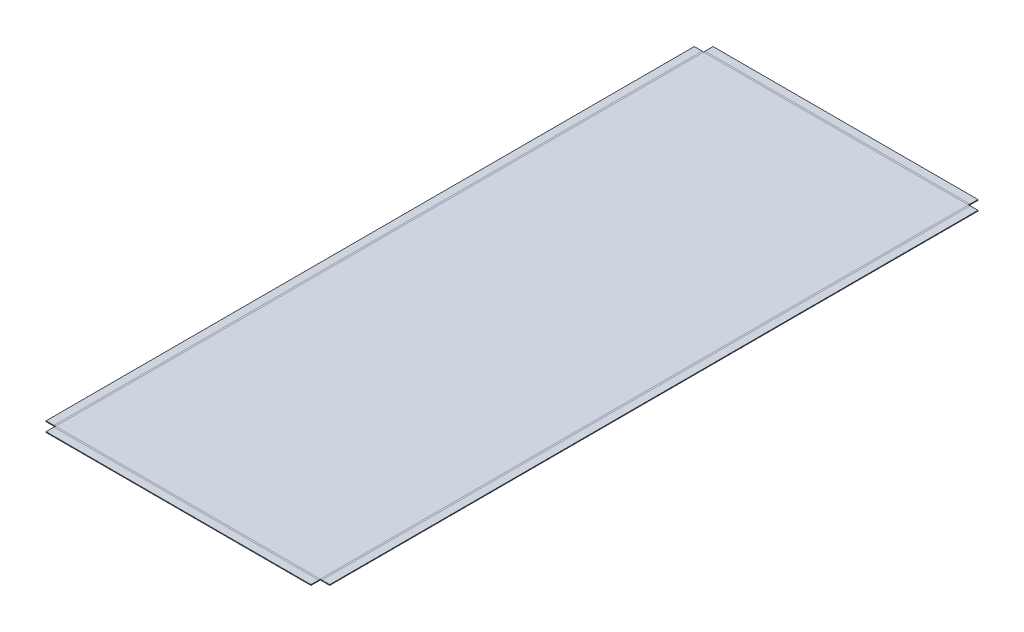
ISO-10303-21;
HEADER;
FILE_DESCRIPTION(('STEP AP214'),'2;1');
FILE_NAME('part.step','',(''),(''),'','','');
FILE_SCHEMA(('AUTOMOTIVE_DESIGN { 1 0 10303 214 1 1 1 1 }'));
ENDSEC;
DATA;
#1=APPLICATION_CONTEXT('core data for automotive mechanical design processes');
#2=APPLICATION_PROTOCOL_DEFINITION('international standard','automotive_design',2000,#1);
#3=PRODUCT_CONTEXT('',#1,'mechanical');
#4=PRODUCT('Part','Part','',(#3));
#5=PRODUCT_RELATED_PRODUCT_CATEGORY('part','',(#4));
#6=PRODUCT_DEFINITION_FORMATION('','',#4);
#7=PRODUCT_DEFINITION_CONTEXT('part definition',#1,'design');
#8=PRODUCT_DEFINITION('design','',#6,#7);
#9=PRODUCT_DEFINITION_SHAPE('','',#8);
#10=(LENGTH_UNIT() NAMED_UNIT(*) SI_UNIT(.MILLI.,.METRE.));
#11=(NAMED_UNIT(*) PLANE_ANGLE_UNIT() SI_UNIT($,.RADIAN.));
#12=(NAMED_UNIT(*) SI_UNIT($,.STERADIAN.) SOLID_ANGLE_UNIT());
#13=UNCERTAINTY_MEASURE_WITH_UNIT(LENGTH_MEASURE(1.E-05),#10,'distance_accuracy_value','');
#14=(GEOMETRIC_REPRESENTATION_CONTEXT(3) GLOBAL_UNCERTAINTY_ASSIGNED_CONTEXT((#13)) GLOBAL_UNIT_ASSIGNED_CONTEXT((#10,
#11,#12)) REPRESENTATION_CONTEXT('',''));
#15=CARTESIAN_POINT('',(0.,0.,0.));
#16=DIRECTION('',(0.,0.,1.));
#17=DIRECTION('',(1.,0.,0.));
#18=AXIS2_PLACEMENT_3D('',#15,#16,#17);
#19=CARTESIAN_POINT('',(0.,1.9,0.));
#20=DIRECTION('',(0.,1.,0.));
#21=DIRECTION('',(0.,0.,1.));
#22=AXIS2_PLACEMENT_3D('',#19,#20,#21);
#23=PLANE('',#22);
#24=DIRECTION('',(1.,0.,0.));
#25=VECTOR('',#24,1.);
#26=CARTESIAN_POINT('',(-356.685786437627,1.9,-872.2));
#27=LINE('',#26,#25);
#28=CARTESIAN_POINT('',(-356.2,1.9,-872.2));
#29=VERTEX_POINT('',#28);
#30=CARTESIAN_POINT('',(356.2,1.90000000000003,-872.2));
#31=VERTEX_POINT('',#30);
#32=EDGE_CURVE('E711',#29,#31,#27,.T.);
#33=ORIENTED_EDGE('',*,*,#32,.F.);
#34=DIRECTION('',(0.,0.,-1.));
#35=VECTOR('',#34,1.);
#36=CARTESIAN_POINT('',(-356.2,1.90000000000003,872.685786437627));
#37=LINE('',#36,#35);
#38=CARTESIAN_POINT('',(-356.2,1.90000000000001,872.2));
#39=VERTEX_POINT('',#38);
#40=EDGE_CURVE('E712',#39,#29,#37,.T.);
#41=ORIENTED_EDGE('',*,*,#40,.F.);
#42=DIRECTION('',(-1.,0.,0.));
#43=VECTOR('',#42,1.);
#44=CARTESIAN_POINT('',(356.685786437627,1.90000000000001,872.2));
#45=LINE('',#44,#43);
#46=CARTESIAN_POINT('',(356.2,1.90000000000001,872.2));
#47=VERTEX_POINT('',#46);
#48=EDGE_CURVE('E862',#47,#39,#45,.T.);
#49=ORIENTED_EDGE('',*,*,#48,.F.);
#50=DIRECTION('',(0.,0.,1.));
#51=VECTOR('',#50,1.);
#52=CARTESIAN_POINT('',(356.2,1.90000000000003,-872.685786437627));
#53=LINE('',#52,#51);
#54=EDGE_CURVE('E794',#31,#47,#53,.T.);
#55=ORIENTED_EDGE('',*,*,#54,.F.);
#56=EDGE_LOOP('',(#33,#41,#49,#55));
#57=FACE_BOUND('',#56,.T.);
#58=ADVANCED_FACE('F171',(#57),#23,.T.);
#59=CARTESIAN_POINT('',(0.,0.,0.));
#60=DIRECTION('',(0.,1.,0.));
#61=DIRECTION('',(0.,0.,1.));
#62=AXIS2_PLACEMENT_3D('',#59,#60,#61);
#63=PLANE('',#62);
#64=DIRECTION('',(0.,0.,-1.));
#65=VECTOR('',#64,1.);
#66=CARTESIAN_POINT('',(-356.2,0.,872.685786437627));
#67=LINE('',#66,#65);
#68=CARTESIAN_POINT('',(-356.2,0.,872.2));
#69=VERTEX_POINT('',#68);
#70=CARTESIAN_POINT('',(-356.2,0.,-872.199999999999));
#71=VERTEX_POINT('',#70);
#72=EDGE_CURVE('E703',#69,#71,#67,.T.);
#73=ORIENTED_EDGE('',*,*,#72,.T.);
#74=DIRECTION('',(1.,0.,0.));
#75=VECTOR('',#74,1.);
#76=CARTESIAN_POINT('',(-356.685786437627,0.,-872.2));
#77=LINE('',#76,#75);
#78=CARTESIAN_POINT('',(356.2,0.,-872.2));
#79=VERTEX_POINT('',#78);
#80=EDGE_CURVE('E776',#71,#79,#77,.T.);
#81=ORIENTED_EDGE('',*,*,#80,.T.);
#82=DIRECTION('',(0.,0.,1.));
#83=VECTOR('',#82,1.);
#84=CARTESIAN_POINT('',(356.2,0.,-872.685786437627));
#85=LINE('',#84,#83);
#86=CARTESIAN_POINT('',(356.2,0.,872.199999999999));
#87=VERTEX_POINT('',#86);
#88=EDGE_CURVE('E863',#79,#87,#85,.T.);
#89=ORIENTED_EDGE('',*,*,#88,.T.);
#90=DIRECTION('',(-1.,0.,0.));
#91=VECTOR('',#90,1.);
#92=CARTESIAN_POINT('',(356.685786437627,0.,872.2));
#93=LINE('',#92,#91);
#94=EDGE_CURVE('E182',#87,#69,#93,.T.);
#95=ORIENTED_EDGE('',*,*,#94,.T.);
#96=EDGE_LOOP('',(#73,#81,#89,#95));
#97=FACE_BOUND('',#96,.T.);
#98=ADVANCED_FACE('F173',(#97),#63,.F.);
#99=CARTESIAN_POINT('',(-356.2,1.89999999999993,-872.199999999999));
#100=DIRECTION('',(0.107879437790235,0.,-0.994163983909125));
#101=DIRECTION('',(-0.994163983909125,0.,-0.107879437790235));
#102=AXIS2_PLACEMENT_3D('',#99,#100,#101);
#103=PLANE('',#102);
#104=DIRECTION('',(0.,1.,0.));
#105=VECTOR('',#104,1.);
#106=CARTESIAN_POINT('',(-356.2,1.89999999999993,-872.199999999999));
#107=LINE('',#106,#105);
#108=EDGE_CURVE('E781',#29,#71,#107,.F.);
#109=ORIENTED_EDGE('',*,*,#108,.T.);
#110=DIRECTION('',(-0.994163983909125,0.,-0.107879437790235));
#111=VECTOR('',#110,1.);
#112=CARTESIAN_POINT('',(-356.2,0.,-872.199999999999));
#113=LINE('',#112,#111);
#114=CARTESIAN_POINT('',(-360.676769531365,0.,-872.685786437625));
#115=VERTEX_POINT('',#114);
#116=EDGE_CURVE('E723',#71,#115,#113,.T.);
#117=ORIENTED_EDGE('',*,*,#116,.T.);
#118=CARTESIAN_POINT('',(-360.676769531365,0.,-872.685786437626));
#119=DIRECTION('',(0.,1.,0.));
#120=VECTOR('',#119,1.);
#121=LINE('',#118,#120);
#122=CARTESIAN_POINT('',(-360.676769531365,1.90000000000001,-872.685786437626));
#123=VERTEX_POINT('',#122);
#124=EDGE_CURVE('E669',#115,#123,#121,.T.);
#125=ORIENTED_EDGE('',*,*,#124,.T.);
#126=DIRECTION('',(-0.994163983909125,0.,-0.107879437790235));
#127=VECTOR('',#126,1.);
#128=CARTESIAN_POINT('',(-356.2,1.89999999999993,-872.199999999999));
#129=LINE('',#128,#127);
#130=EDGE_CURVE('E788',#29,#123,#129,.T.);
#131=ORIENTED_EDGE('',*,*,#130,.F.);
#132=EDGE_LOOP('',(#109,#117,#125,#131));
#133=FACE_BOUND('',#132,.T.);
#134=ADVANCED_FACE('F683',(#133),#103,.T.);
#135=CARTESIAN_POINT('',(-360.676769531365,1.89999999999993,872.685786437627));
#136=DIRECTION('',(0.107879437790241,0.,0.994163983909124));
#137=DIRECTION('',(0.994163983909124,0.,-0.107879437790241));
#138=AXIS2_PLACEMENT_3D('',#135,#136,#137);
#139=PLANE('',#138);
#140=DIRECTION('',(0.994163983909124,0.,-0.107879437790241));
#141=VECTOR('',#140,1.);
#142=CARTESIAN_POINT('',(-360.676769531365,0.,872.685786437627));
#143=LINE('',#142,#141);
#144=CARTESIAN_POINT('',(-360.676769531365,4.44089209850063E-13,872.685786437627));
#145=VERTEX_POINT('',#144);
#146=EDGE_CURVE('E785',#145,#69,#143,.T.);
#147=ORIENTED_EDGE('',*,*,#146,.T.);
#148=DIRECTION('',(0.,1.,0.));
#149=VECTOR('',#148,1.);
#150=CARTESIAN_POINT('',(-356.2,1.90000000000001,872.2));
#151=LINE('',#150,#149);
#152=EDGE_CURVE('E923',#39,#69,#151,.F.);
#153=ORIENTED_EDGE('',*,*,#152,.F.);
#154=DIRECTION('',(0.994163983909124,0.,-0.107879437790241));
#155=VECTOR('',#154,1.);
#156=CARTESIAN_POINT('',(-360.676769531365,1.89999999999993,872.685786437627));
#157=LINE('',#156,#155);
#158=CARTESIAN_POINT('',(-360.676769531365,1.9000000000002,872.685786437627));
#159=VERTEX_POINT('',#158);
#160=EDGE_CURVE('E717',#159,#39,#157,.T.);
#161=ORIENTED_EDGE('',*,*,#160,.F.);
#162=CARTESIAN_POINT('',(-360.676769531365,4.44089209850063E-13,872.685786437627));
#163=DIRECTION('',(0.,1.,0.));
#164=VECTOR('',#163,1.);
#165=LINE('',#162,#164);
#166=EDGE_CURVE('E658',#145,#159,#165,.T.);
#167=ORIENTED_EDGE('',*,*,#166,.F.);
#168=EDGE_LOOP('',(#147,#153,#161,#167));
#169=FACE_BOUND('',#168,.T.);
#170=ADVANCED_FACE('F693',(#169),#139,.T.);
#171=CARTESIAN_POINT('',(-358.438384765683,1.89999999999993,3.33066907387547E-13));
#172=DIRECTION('',(0.,1.,0.));
#173=DIRECTION('',(0.,0.,1.));
#174=AXIS2_PLACEMENT_3D('',#171,#172,#173);
#175=PLANE('',#174);
#176=DIRECTION('',(0.,0.,1.));
#177=VECTOR('',#176,1.);
#178=CARTESIAN_POINT('',(-360.676769531366,1.90000000000001,-876.));
#179=LINE('',#178,#177);
#180=EDGE_CURVE('E726',#123,#159,#179,.T.);
#181=ORIENTED_EDGE('',*,*,#180,.T.);
#182=ORIENTED_EDGE('',*,*,#160,.T.);
#183=ORIENTED_EDGE('',*,*,#40,.T.);
#184=ORIENTED_EDGE('',*,*,#130,.T.);
#185=EDGE_LOOP('',(#181,#182,#183,#184));
#186=FACE_BOUND('',#185,.T.);
#187=ADVANCED_FACE('F698',(#186),#175,.T.);
#188=CARTESIAN_POINT('',(-358.438384765683,0.,3.33066907387547E-13));
#189=DIRECTION('',(0.,1.,0.));
#190=DIRECTION('',(0.,0.,1.));
#191=AXIS2_PLACEMENT_3D('',#188,#189,#190);
#192=PLANE('',#191);
#193=DIRECTION('',(0.,0.,-1.));
#194=VECTOR('',#193,1.);
#195=CARTESIAN_POINT('',(-360.676769531366,0.,-876.));
#196=LINE('',#195,#194);
#197=EDGE_CURVE('E729',#145,#115,#196,.T.);
#198=ORIENTED_EDGE('',*,*,#197,.T.);
#199=ORIENTED_EDGE('',*,*,#116,.F.);
#200=ORIENTED_EDGE('',*,*,#72,.F.);
#201=ORIENTED_EDGE('',*,*,#146,.F.);
#202=EDGE_LOOP('',(#198,#199,#200,#201));
#203=FACE_BOUND('',#202,.T.);
#204=ADVANCED_FACE('F694',(#203),#192,.F.);
#205=CARTESIAN_POINT('',(-381.876769531366,-1.66533453693773E-13,-876.));
#206=DIRECTION('',(1.,0.,0.));
#207=DIRECTION('',(0.,1.,0.));
#208=AXIS2_PLACEMENT_3D('',#205,#206,#207);
#209=PLANE('',#208);
#210=DIRECTION('',(0.,0.,-1.));
#211=VECTOR('',#210,1.);
#212=CARTESIAN_POINT('',(-381.876769531365,0.,0.));
#213=LINE('',#212,#211);
#214=CARTESIAN_POINT('',(-381.876769531365,2.77555756156289E-13,872.685786437627));
#215=VERTEX_POINT('',#214);
#216=CARTESIAN_POINT('',(-381.876769531366,-1.66533453693773E-13,-872.685786437627));
#217=VERTEX_POINT('',#216);
#218=EDGE_CURVE('E651',#215,#217,#213,.T.);
#219=ORIENTED_EDGE('',*,*,#218,.F.);
#220=DIRECTION('',(0.,1.,0.));
#221=VECTOR('',#220,1.);
#222=CARTESIAN_POINT('',(-381.876769531365,0.,872.685786437627));
#223=LINE('',#222,#221);
#224=CARTESIAN_POINT('',(-381.876769531365,1.90000000000029,872.685786437627));
#225=VERTEX_POINT('',#224);
#226=EDGE_CURVE('E667',#215,#225,#223,.T.);
#227=ORIENTED_EDGE('',*,*,#226,.T.);
#228=DIRECTION('',(0.,0.,1.));
#229=VECTOR('',#228,1.);
#230=CARTESIAN_POINT('',(-381.876769531366,1.89999999999985,-876.));
#231=LINE('',#230,#229);
#232=CARTESIAN_POINT('',(-381.876769531366,1.89999999999985,-872.685786437627));
#233=VERTEX_POINT('',#232);
#234=EDGE_CURVE('E664',#225,#233,#231,.F.);
#235=ORIENTED_EDGE('',*,*,#234,.T.);
#236=DIRECTION('',(0.,-1.,0.));
#237=VECTOR('',#236,1.);
#238=CARTESIAN_POINT('',(-381.876769531366,1.89999999999985,-872.685786437627));
#239=LINE('',#238,#237);
#240=EDGE_CURVE('E660',#217,#233,#239,.F.);
#241=ORIENTED_EDGE('',*,*,#240,.F.);
#242=EDGE_LOOP('',(#219,#227,#235,#241));
#243=FACE_BOUND('',#242,.T.);
#244=ADVANCED_FACE('F620',(#243),#209,.F.);
#245=CARTESIAN_POINT('',(-356.876769531365,1.90000000000023,0.));
#246=DIRECTION('',(0.,1.,0.));
#247=DIRECTION('',(-1.,0.,0.));
#248=AXIS2_PLACEMENT_3D('',#245,#246,#247);
#249=PLANE('',#248);
#250=DIRECTION('',(1.,0.,0.));
#251=VECTOR('',#250,1.);
#252=CARTESIAN_POINT('',(-358.776769531365,1.90000000000046,872.685786437627));
#253=LINE('',#252,#251);
#254=EDGE_CURVE('E720',#159,#225,#253,.F.);
#255=ORIENTED_EDGE('',*,*,#254,.F.);
#256=ORIENTED_EDGE('',*,*,#180,.F.);
#257=DIRECTION('',(-1.,0.,0.));
#258=VECTOR('',#257,1.);
#259=CARTESIAN_POINT('',(-356.876769531365,1.90000000000001,-872.685786437627));
#260=LINE('',#259,#258);
#261=EDGE_CURVE('E666',#123,#233,#260,.T.);
#262=ORIENTED_EDGE('',*,*,#261,.T.);
#263=ORIENTED_EDGE('',*,*,#234,.F.);
#264=EDGE_LOOP('',(#255,#256,#262,#263));
#265=FACE_BOUND('',#264,.T.);
#266=ADVANCED_FACE('F755',(#265),#249,.T.);
#267=CARTESIAN_POINT('',(-358.776769531366,1.90000000000001,-872.685786437627));
#268=DIRECTION('',(0.,0.,-1.));
#269=DIRECTION('',(-1.,0.,0.));
#270=AXIS2_PLACEMENT_3D('',#267,#268,#269);
#271=PLANE('',#270);
#272=DIRECTION('',(1.,0.,0.));
#273=VECTOR('',#272,1.);
#274=CARTESIAN_POINT('',(-358.776769531366,0.,-872.685786437627));
#275=LINE('',#274,#273);
#276=EDGE_CURVE('E663',#115,#217,#275,.F.);
#277=ORIENTED_EDGE('',*,*,#276,.T.);
#278=ORIENTED_EDGE('',*,*,#240,.T.);
#279=ORIENTED_EDGE('',*,*,#261,.F.);
#280=ORIENTED_EDGE('',*,*,#124,.F.);
#281=EDGE_LOOP('',(#277,#278,#279,#280));
#282=FACE_BOUND('',#281,.T.);
#283=ADVANCED_FACE('F745',(#282),#271,.T.);
#284=CARTESIAN_POINT('',(-356.876769531365,2.22044604925031E-13,0.));
#285=DIRECTION('',(0.,1.,0.));
#286=DIRECTION('',(-1.,0.,0.));
#287=AXIS2_PLACEMENT_3D('',#284,#285,#286);
#288=PLANE('',#287);
#289=ORIENTED_EDGE('',*,*,#197,.F.);
#290=DIRECTION('',(-1.,0.,0.));
#291=VECTOR('',#290,1.);
#292=CARTESIAN_POINT('',(-356.876769531364,4.44089209850063E-13,872.685786437627));
#293=LINE('',#292,#291);
#294=EDGE_CURVE('E659',#145,#215,#293,.T.);
#295=ORIENTED_EDGE('',*,*,#294,.T.);
#296=ORIENTED_EDGE('',*,*,#218,.T.);
#297=ORIENTED_EDGE('',*,*,#276,.F.);
#298=EDGE_LOOP('',(#289,#295,#296,#297));
#299=FACE_BOUND('',#298,.T.);
#300=ADVANCED_FACE('F754',(#299),#288,.F.);
#301=CARTESIAN_POINT('',(-358.776769531365,1.90000000000046,872.685786437627));
#302=DIRECTION('',(0.,0.,-1.));
#303=DIRECTION('',(-1.,0.,0.));
#304=AXIS2_PLACEMENT_3D('',#301,#302,#303);
#305=PLANE('',#304);
#306=ORIENTED_EDGE('',*,*,#226,.F.);
#307=ORIENTED_EDGE('',*,*,#294,.F.);
#308=ORIENTED_EDGE('',*,*,#166,.T.);
#309=ORIENTED_EDGE('',*,*,#254,.T.);
#310=EDGE_LOOP('',(#306,#307,#308,#309));
#311=FACE_BOUND('',#310,.T.);
#312=ADVANCED_FACE('F758',(#311),#305,.F.);
#313=CARTESIAN_POINT('',(356.2,1.9,-872.2));
#314=DIRECTION('',(0.994163983909123,0.,0.107879437790257));
#315=DIRECTION('',(0.107879437790257,0.,-0.994163983909123));
#316=AXIS2_PLACEMENT_3D('',#313,#314,#315);
#317=PLANE('',#316);
#318=DIRECTION('',(0.,1.,0.));
#319=VECTOR('',#318,1.);
#320=CARTESIAN_POINT('',(356.2,1.9,-872.2));
#321=LINE('',#320,#319);
#322=EDGE_CURVE('E852',#31,#79,#321,.F.);
#323=ORIENTED_EDGE('',*,*,#322,.T.);
#324=DIRECTION('',(0.107879437790257,0.,-0.994163983909123));
#325=VECTOR('',#324,1.);
#326=CARTESIAN_POINT('',(356.2,0.,-872.2));
#327=LINE('',#326,#325);
#328=CARTESIAN_POINT('',(356.685786437626,0.,-876.676769531365));
#329=VERTEX_POINT('',#328);
#330=EDGE_CURVE('E800',#79,#329,#327,.T.);
#331=ORIENTED_EDGE('',*,*,#330,.T.);
#332=CARTESIAN_POINT('',(356.685786437627,0.,-876.676769531365));
#333=DIRECTION('',(0.,1.,0.));
#334=VECTOR('',#333,1.);
#335=LINE('',#332,#334);
#336=CARTESIAN_POINT('',(356.685786437626,1.90000000000001,-876.676769531365));
#337=VERTEX_POINT('',#336);
#338=EDGE_CURVE('E563',#329,#337,#335,.T.);
#339=ORIENTED_EDGE('',*,*,#338,.T.);
#340=DIRECTION('',(0.107879437790257,0.,-0.994163983909123));
#341=VECTOR('',#340,1.);
#342=CARTESIAN_POINT('',(356.2,1.9,-872.2));
#343=LINE('',#342,#341);
#344=EDGE_CURVE('E850',#31,#337,#343,.T.);
#345=ORIENTED_EDGE('',*,*,#344,.F.);
#346=EDGE_LOOP('',(#323,#331,#339,#345));
#347=FACE_BOUND('',#346,.T.);
#348=ADVANCED_FACE('F590',(#347),#317,.T.);
#349=CARTESIAN_POINT('',(-356.685786437627,1.9,-876.676769531365));
#350=DIRECTION('',(-0.994163983909123,0.,0.107879437790257));
#351=DIRECTION('',(0.107879437790257,0.,0.994163983909123));
#352=AXIS2_PLACEMENT_3D('',#349,#350,#351);
#353=PLANE('',#352);
#354=CARTESIAN_POINT('',(-356.685786437627,0.,-876.676769531365));
#355=DIRECTION('',(0.107879437790257,0.,0.994163983909123));
#356=VECTOR('',#355,1.);
#357=LINE('',#354,#356);
#358=CARTESIAN_POINT('',(-356.685786437627,0.,-876.676769531365));
#359=VERTEX_POINT('',#358);
#360=EDGE_CURVE('E853',#359,#71,#357,.T.);
#361=ORIENTED_EDGE('',*,*,#360,.T.);
#362=ORIENTED_EDGE('',*,*,#108,.F.);
#363=CARTESIAN_POINT('',(-356.685786437627,1.9,-876.676769531365));
#364=DIRECTION('',(0.107879437790257,0.,0.994163983909123));
#365=VECTOR('',#364,1.);
#366=LINE('',#363,#365);
#367=CARTESIAN_POINT('',(-356.685786437627,1.9,-876.676769531365));
#368=VERTEX_POINT('',#367);
#369=EDGE_CURVE('E607',#368,#29,#366,.T.);
#370=ORIENTED_EDGE('',*,*,#369,.F.);
#371=CARTESIAN_POINT('',(-356.685786437627,0.,-876.676769531365));
#372=DIRECTION('',(0.,1.,0.));
#373=VECTOR('',#372,1.);
#374=LINE('',#371,#373);
#375=EDGE_CURVE('E552',#359,#368,#374,.T.);
#376=ORIENTED_EDGE('',*,*,#375,.F.);
#377=EDGE_LOOP('',(#361,#362,#370,#376));
#378=FACE_BOUND('',#377,.T.);
#379=ADVANCED_FACE('F581',(#378),#353,.T.);
#380=CARTESIAN_POINT('',(-1.66533453693773E-13,1.9,-874.438384765682));
#381=DIRECTION('',(0.,1.,0.));
#382=DIRECTION('',(0.,0.,1.));
#383=AXIS2_PLACEMENT_3D('',#380,#381,#382);
#384=PLANE('',#383);
#385=DIRECTION('',(-1.,0.,0.));
#386=VECTOR('',#385,1.);
#387=CARTESIAN_POINT('',(360.,1.90000000000001,-876.676769531365));
#388=LINE('',#387,#386);
#389=EDGE_CURVE('E803',#337,#368,#388,.T.);
#390=ORIENTED_EDGE('',*,*,#389,.T.);
#391=ORIENTED_EDGE('',*,*,#369,.T.);
#392=ORIENTED_EDGE('',*,*,#32,.T.);
#393=ORIENTED_EDGE('',*,*,#344,.T.);
#394=EDGE_LOOP('',(#390,#391,#392,#393));
#395=FACE_BOUND('',#394,.T.);
#396=ADVANCED_FACE('F570',(#395),#384,.T.);
#397=CARTESIAN_POINT('',(-1.66533453693773E-13,0.,-874.438384765682));
#398=DIRECTION('',(0.,1.,0.));
#399=DIRECTION('',(0.,0.,1.));
#400=AXIS2_PLACEMENT_3D('',#397,#398,#399);
#401=PLANE('',#400);
#402=DIRECTION('',(1.,0.,0.));
#403=VECTOR('',#402,1.);
#404=CARTESIAN_POINT('',(360.,0.,-876.676769531365));
#405=LINE('',#404,#403);
#406=EDGE_CURVE('E806',#359,#329,#405,.T.);
#407=ORIENTED_EDGE('',*,*,#406,.T.);
#408=ORIENTED_EDGE('',*,*,#330,.F.);
#409=ORIENTED_EDGE('',*,*,#80,.F.);
#410=ORIENTED_EDGE('',*,*,#360,.F.);
#411=EDGE_LOOP('',(#407,#408,#409,#410));
#412=FACE_BOUND('',#411,.T.);
#413=ADVANCED_FACE('F580',(#412),#401,.F.);
#414=CARTESIAN_POINT('',(360.,-2.22044604925031E-13,-897.876769531365));
#415=DIRECTION('',(0.,0.,1.));
#416=DIRECTION('',(0.,-1.,0.));
#417=AXIS2_PLACEMENT_3D('',#414,#415,#416);
#418=PLANE('',#417);
#419=DIRECTION('',(1.,0.,0.));
#420=VECTOR('',#419,1.);
#421=CARTESIAN_POINT('',(0.,-2.22044604925031E-13,-897.876769531365));
#422=LINE('',#421,#420);
#423=CARTESIAN_POINT('',(-356.685786437627,-2.22044604925031E-13,-897.876769531365));
#424=VERTEX_POINT('',#423);
#425=CARTESIAN_POINT('',(356.685786437627,-2.22044604925031E-13,-897.876769531365));
#426=VERTEX_POINT('',#425);
#427=EDGE_CURVE('E545',#424,#426,#422,.T.);
#428=ORIENTED_EDGE('',*,*,#427,.F.);
#429=DIRECTION('',(0.,1.,0.));
#430=VECTOR('',#429,1.);
#431=CARTESIAN_POINT('',(-356.685786437627,-2.22044604925031E-13,-897.876769531365));
#432=LINE('',#431,#430);
#433=CARTESIAN_POINT('',(-356.685786437627,1.89999999999979,-897.876769531365));
#434=VERTEX_POINT('',#433);
#435=EDGE_CURVE('E561',#424,#434,#432,.T.);
#436=ORIENTED_EDGE('',*,*,#435,.T.);
#437=DIRECTION('',(-1.,0.,0.));
#438=VECTOR('',#437,1.);
#439=CARTESIAN_POINT('',(360.,1.89999999999979,-897.876769531365));
#440=LINE('',#439,#438);
#441=CARTESIAN_POINT('',(356.685786437627,1.89999999999979,-897.876769531365));
#442=VERTEX_POINT('',#441);
#443=EDGE_CURVE('E558',#434,#442,#440,.F.);
#444=ORIENTED_EDGE('',*,*,#443,.T.);
#445=DIRECTION('',(0.,-1.,0.));
#446=VECTOR('',#445,1.);
#447=CARTESIAN_POINT('',(356.685786437627,1.89999999999979,-897.876769531365));
#448=LINE('',#447,#446);
#449=EDGE_CURVE('E554',#426,#442,#448,.F.);
#450=ORIENTED_EDGE('',*,*,#449,.F.);
#451=EDGE_LOOP('',(#428,#436,#444,#450));
#452=FACE_BOUND('',#451,.T.);
#453=ADVANCED_FACE('F514',(#452),#418,.F.);
#454=CARTESIAN_POINT('',(0.,1.90000000000001,-872.876769531361));
#455=DIRECTION('',(0.,1.,0.));
#456=DIRECTION('',(0.,0.,1.));
#457=AXIS2_PLACEMENT_3D('',#454,#455,#456);
#458=PLANE('',#457);
#459=DIRECTION('',(0.,0.,1.));
#460=VECTOR('',#459,1.);
#461=CARTESIAN_POINT('',(-356.685786437627,1.90000000000001,-874.776769531365));
#462=LINE('',#461,#460);
#463=EDGE_CURVE('E797',#368,#434,#462,.F.);
#464=ORIENTED_EDGE('',*,*,#463,.F.);
#465=ORIENTED_EDGE('',*,*,#389,.F.);
#466=DIRECTION('',(0.,0.,-1.));
#467=VECTOR('',#466,1.);
#468=CARTESIAN_POINT('',(356.685786437627,1.90000000000001,-872.876769531361));
#469=LINE('',#468,#467);
#470=EDGE_CURVE('E560',#337,#442,#469,.T.);
#471=ORIENTED_EDGE('',*,*,#470,.T.);
#472=ORIENTED_EDGE('',*,*,#443,.F.);
#473=EDGE_LOOP('',(#464,#465,#471,#472));
#474=FACE_BOUND('',#473,.T.);
#475=ADVANCED_FACE('F831',(#474),#458,.T.);
#476=CARTESIAN_POINT('',(356.685786437627,1.90000000000001,-874.776769531365));
#477=DIRECTION('',(1.,0.,0.));
#478=DIRECTION('',(0.,-1.,0.));
#479=AXIS2_PLACEMENT_3D('',#476,#477,#478);
#480=PLANE('',#479);
#481=DIRECTION('',(0.,0.,1.));
#482=VECTOR('',#481,1.);
#483=CARTESIAN_POINT('',(356.685786437627,0.,-874.776769531365));
#484=LINE('',#483,#482);
#485=EDGE_CURVE('E557',#329,#426,#484,.F.);
#486=ORIENTED_EDGE('',*,*,#485,.T.);
#487=ORIENTED_EDGE('',*,*,#449,.T.);
#488=ORIENTED_EDGE('',*,*,#470,.F.);
#489=ORIENTED_EDGE('',*,*,#338,.F.);
#490=EDGE_LOOP('',(#486,#487,#488,#489));
#491=FACE_BOUND('',#490,.T.);
#492=ADVANCED_FACE('F822',(#491),#480,.T.);
#493=CARTESIAN_POINT('',(0.,0.,-872.876769531361));
#494=DIRECTION('',(0.,1.,0.));
#495=DIRECTION('',(0.,0.,1.));
#496=AXIS2_PLACEMENT_3D('',#493,#494,#495);
#497=PLANE('',#496);
#498=ORIENTED_EDGE('',*,*,#406,.F.);
#499=DIRECTION('',(0.,0.,-1.));
#500=VECTOR('',#499,1.);
#501=CARTESIAN_POINT('',(-356.685786437627,0.,-872.876769531361));
#502=LINE('',#501,#500);
#503=EDGE_CURVE('E553',#359,#424,#502,.T.);
#504=ORIENTED_EDGE('',*,*,#503,.T.);
#505=ORIENTED_EDGE('',*,*,#427,.T.);
#506=ORIENTED_EDGE('',*,*,#485,.F.);
#507=EDGE_LOOP('',(#498,#504,#505,#506));
#508=FACE_BOUND('',#507,.T.);
#509=ADVANCED_FACE('F830',(#508),#497,.F.);
#510=CARTESIAN_POINT('',(-356.685786437627,1.90000000000001,-874.776769531365));
#511=DIRECTION('',(1.,0.,0.));
#512=DIRECTION('',(0.,-1.,0.));
#513=AXIS2_PLACEMENT_3D('',#510,#511,#512);
#514=PLANE('',#513);
#515=ORIENTED_EDGE('',*,*,#435,.F.);
#516=ORIENTED_EDGE('',*,*,#503,.F.);
#517=ORIENTED_EDGE('',*,*,#375,.T.);
#518=ORIENTED_EDGE('',*,*,#463,.T.);
#519=EDGE_LOOP('',(#515,#516,#517,#518));
#520=FACE_BOUND('',#519,.T.);
#521=ADVANCED_FACE('F583',(#520),#514,.F.);
#522=CARTESIAN_POINT('',(356.2,1.89999999999993,872.199999999999));
#523=DIRECTION('',(-0.10787943779023,0.,0.994163983909126));
#524=DIRECTION('',(0.994163983909126,0.,0.10787943779023));
#525=AXIS2_PLACEMENT_3D('',#522,#523,#524);
#526=PLANE('',#525);
#527=DIRECTION('',(0.,1.,0.));
#528=VECTOR('',#527,1.);
#529=CARTESIAN_POINT('',(356.2,1.89999999999993,872.199999999999));
#530=LINE('',#529,#528);
#531=EDGE_CURVE('E13',#47,#87,#530,.F.);
#532=ORIENTED_EDGE('',*,*,#531,.T.);
#533=DIRECTION('',(0.994163983909126,0.,0.10787943779023));
#534=VECTOR('',#533,1.);
#535=CARTESIAN_POINT('',(356.2,0.,872.199999999999));
#536=LINE('',#535,#534);
#537=CARTESIAN_POINT('',(360.676769531365,-1.66533453693773E-13,872.685786437625));
#538=VERTEX_POINT('',#537);
#539=EDGE_CURVE('E869',#87,#538,#536,.T.);
#540=ORIENTED_EDGE('',*,*,#539,.T.);
#541=CARTESIAN_POINT('',(360.676769531365,0.,872.685786437626));
#542=DIRECTION('',(0.,1.,0.));
#543=VECTOR('',#542,1.);
#544=LINE('',#541,#543);
#545=CARTESIAN_POINT('',(360.676769531365,1.89999999999985,872.685786437626));
#546=VERTEX_POINT('',#545);
#547=EDGE_CURVE('E461',#538,#546,#544,.T.);
#548=ORIENTED_EDGE('',*,*,#547,.T.);
#549=DIRECTION('',(0.994163983909125,0.,0.10787943779023));
#550=VECTOR('',#549,1.);
#551=CARTESIAN_POINT('',(356.2,1.89999999999993,872.199999999999));
#552=LINE('',#551,#550);
#553=EDGE_CURVE('E911',#47,#546,#552,.T.);
#554=ORIENTED_EDGE('',*,*,#553,.F.);
#555=EDGE_LOOP('',(#532,#540,#548,#554));
#556=FACE_BOUND('',#555,.T.);
#557=ADVANCED_FACE('F488',(#556),#526,.T.);
#558=CARTESIAN_POINT('',(360.676769531365,1.89999999999993,-872.685786437627));
#559=DIRECTION('',(-0.107879437790284,0.,-0.99416398390912));
#560=DIRECTION('',(-0.99416398390912,0.,0.107879437790284));
#561=AXIS2_PLACEMENT_3D('',#558,#559,#560);
#562=PLANE('',#561);
#563=CARTESIAN_POINT('',(360.676769531365,0.,-872.685786437627));
#564=DIRECTION('',(-0.99416398390912,0.,0.107879437790284));
#565=VECTOR('',#564,1.);
#566=LINE('',#563,#565);
#567=CARTESIAN_POINT('',(360.676769531365,2.77555756156289E-13,-872.685786437627));
#568=VERTEX_POINT('',#567);
#569=EDGE_CURVE('E199',#568,#79,#566,.T.);
#570=ORIENTED_EDGE('',*,*,#569,.T.);
#571=ORIENTED_EDGE('',*,*,#322,.F.);
#572=CARTESIAN_POINT('',(360.676769531365,1.89999999999993,-872.685786437627));
#573=DIRECTION('',(-0.99416398390912,0.,0.107879437790284));
#574=VECTOR('',#573,1.);
#575=LINE('',#572,#574);
#576=CARTESIAN_POINT('',(360.676769531365,1.90000000000003,-872.685786437626));
#577=VERTEX_POINT('',#576);
#578=EDGE_CURVE('E502',#577,#31,#575,.T.);
#579=ORIENTED_EDGE('',*,*,#578,.F.);
#580=CARTESIAN_POINT('',(360.676769531365,2.77555756156289E-13,-872.685786437627));
#581=DIRECTION('',(0.,1.,0.));
#582=VECTOR('',#581,1.);
#583=LINE('',#580,#582);
#584=EDGE_CURVE('E450',#568,#577,#583,.T.);
#585=ORIENTED_EDGE('',*,*,#584,.F.);
#586=EDGE_LOOP('',(#570,#571,#579,#585));
#587=FACE_BOUND('',#586,.T.);
#588=ADVANCED_FACE('F479',(#587),#562,.T.);
#589=CARTESIAN_POINT('',(358.438384765683,1.89999999999993,-1.11022302462516E-13));
#590=DIRECTION('',(0.,1.,0.));
#591=DIRECTION('',(0.,0.,1.));
#592=AXIS2_PLACEMENT_3D('',#589,#590,#591);
#593=PLANE('',#592);
#594=DIRECTION('',(0.,0.,-1.));
#595=VECTOR('',#594,1.);
#596=CARTESIAN_POINT('',(360.676769531365,1.89999999999985,876.));
#597=LINE('',#596,#595);
#598=EDGE_CURVE('E872',#546,#577,#597,.T.);
#599=ORIENTED_EDGE('',*,*,#598,.T.);
#600=ORIENTED_EDGE('',*,*,#578,.T.);
#601=ORIENTED_EDGE('',*,*,#54,.T.);
#602=ORIENTED_EDGE('',*,*,#553,.T.);
#603=EDGE_LOOP('',(#599,#600,#601,#602));
#604=FACE_BOUND('',#603,.T.);
#605=ADVANCED_FACE('F468',(#604),#593,.T.);
#606=CARTESIAN_POINT('',(358.438384765683,0.,-1.11022302462516E-13));
#607=DIRECTION('',(0.,1.,0.));
#608=DIRECTION('',(0.,0.,1.));
#609=AXIS2_PLACEMENT_3D('',#606,#607,#608);
#610=PLANE('',#609);
#611=DIRECTION('',(0.,0.,1.));
#612=VECTOR('',#611,1.);
#613=CARTESIAN_POINT('',(360.676769531365,-1.66533453693773E-13,876.));
#614=LINE('',#613,#612);
#615=EDGE_CURVE('E875',#568,#538,#614,.T.);
#616=ORIENTED_EDGE('',*,*,#615,.T.);
#617=ORIENTED_EDGE('',*,*,#539,.F.);
#618=ORIENTED_EDGE('',*,*,#88,.F.);
#619=ORIENTED_EDGE('',*,*,#569,.F.);
#620=EDGE_LOOP('',(#616,#617,#618,#619));
#621=FACE_BOUND('',#620,.T.);
#622=ADVANCED_FACE('F478',(#621),#610,.F.);
#623=CARTESIAN_POINT('',(381.876769531365,-3.33066907387547E-13,876.));
#624=DIRECTION('',(-1.,0.,0.));
#625=DIRECTION('',(0.,-1.,0.));
#626=AXIS2_PLACEMENT_3D('',#623,#624,#625);
#627=PLANE('',#626);
#628=DIRECTION('',(0.,0.,1.));
#629=VECTOR('',#628,1.);
#630=CARTESIAN_POINT('',(381.876769531365,-1.11022302462516E-13,0.));
#631=LINE('',#630,#629);
#632=CARTESIAN_POINT('',(381.876769531365,1.11022302462516E-13,-872.685786437627));
#633=VERTEX_POINT('',#632);
#634=CARTESIAN_POINT('',(381.876769531365,-3.33066907387547E-13,872.685786437627));
#635=VERTEX_POINT('',#634);
#636=EDGE_CURVE('E443',#633,#635,#631,.T.);
#637=ORIENTED_EDGE('',*,*,#636,.F.);
#638=DIRECTION('',(0.,1.,0.));
#639=VECTOR('',#638,1.);
#640=CARTESIAN_POINT('',(381.876769531365,-1.11022302462516E-13,-872.685786437627));
#641=LINE('',#640,#639);
#642=CARTESIAN_POINT('',(381.876769531365,1.90000000000012,-872.685786437627));
#643=VERTEX_POINT('',#642);
#644=EDGE_CURVE('E459',#633,#643,#641,.T.);
#645=ORIENTED_EDGE('',*,*,#644,.T.);
#646=DIRECTION('',(0.,0.,-1.));
#647=VECTOR('',#646,1.);
#648=CARTESIAN_POINT('',(381.876769531365,1.89999999999968,876.));
#649=LINE('',#648,#647);
#650=CARTESIAN_POINT('',(381.876769531365,1.89999999999968,872.685786437627));
#651=VERTEX_POINT('',#650);
#652=EDGE_CURVE('E456',#643,#651,#649,.F.);
#653=ORIENTED_EDGE('',*,*,#652,.T.);
#654=DIRECTION('',(0.,-1.,0.));
#655=VECTOR('',#654,1.);
#656=CARTESIAN_POINT('',(381.876769531365,1.89999999999968,872.685786437627));
#657=LINE('',#656,#655);
#658=EDGE_CURVE('E452',#635,#651,#657,.F.);
#659=ORIENTED_EDGE('',*,*,#658,.F.);
#660=EDGE_LOOP('',(#637,#645,#653,#659));
#661=FACE_BOUND('',#660,.T.);
#662=ADVANCED_FACE('F415',(#661),#627,.F.);
#663=CARTESIAN_POINT('',(356.876769531364,1.90000000000007,0.));
#664=DIRECTION('',(0.,1.,0.));
#665=DIRECTION('',(-1.,0.,0.));
#666=AXIS2_PLACEMENT_3D('',#663,#664,#665);
#667=PLANE('',#666);
#668=DIRECTION('',(-1.,0.,0.));
#669=VECTOR('',#668,1.);
#670=CARTESIAN_POINT('',(358.776769531365,1.90000000000029,-872.685786437627));
#671=LINE('',#670,#669);
#672=EDGE_CURVE('E866',#577,#643,#671,.F.);
#673=ORIENTED_EDGE('',*,*,#672,.F.);
#674=ORIENTED_EDGE('',*,*,#598,.F.);
#675=DIRECTION('',(1.,0.,0.));
#676=VECTOR('',#675,1.);
#677=CARTESIAN_POINT('',(356.876769531364,1.89999999999985,872.685786437627));
#678=LINE('',#677,#676);
#679=EDGE_CURVE('E458',#546,#651,#678,.T.);
#680=ORIENTED_EDGE('',*,*,#679,.T.);
#681=ORIENTED_EDGE('',*,*,#652,.F.);
#682=EDGE_LOOP('',(#673,#674,#680,#681));
#683=FACE_BOUND('',#682,.T.);
#684=ADVANCED_FACE('F900',(#683),#667,.T.);
#685=CARTESIAN_POINT('',(358.776769531365,1.89999999999985,872.685786437627));
#686=DIRECTION('',(0.,0.,1.));
#687=DIRECTION('',(-1.,0.,0.));
#688=AXIS2_PLACEMENT_3D('',#685,#686,#687);
#689=PLANE('',#688);
#690=DIRECTION('',(-1.,0.,0.));
#691=VECTOR('',#690,1.);
#692=CARTESIAN_POINT('',(358.776769531365,-1.66533453693773E-13,872.685786437627));
#693=LINE('',#692,#691);
#694=EDGE_CURVE('E455',#538,#635,#693,.F.);
#695=ORIENTED_EDGE('',*,*,#694,.T.);
#696=ORIENTED_EDGE('',*,*,#658,.T.);
#697=ORIENTED_EDGE('',*,*,#679,.F.);
#698=ORIENTED_EDGE('',*,*,#547,.F.);
#699=EDGE_LOOP('',(#695,#696,#697,#698));
#700=FACE_BOUND('',#699,.T.);
#701=ADVANCED_FACE('F891',(#700),#689,.T.);
#702=CARTESIAN_POINT('',(356.876769531364,0.,0.));
#703=DIRECTION('',(0.,1.,0.));
#704=DIRECTION('',(-1.,0.,0.));
#705=AXIS2_PLACEMENT_3D('',#702,#703,#704);
#706=PLANE('',#705);
#707=ORIENTED_EDGE('',*,*,#615,.F.);
#708=DIRECTION('',(1.,0.,0.));
#709=VECTOR('',#708,1.);
#710=CARTESIAN_POINT('',(356.876769531364,2.77555756156289E-13,-872.685786437627));
#711=LINE('',#710,#709);
#712=EDGE_CURVE('E451',#568,#633,#711,.T.);
#713=ORIENTED_EDGE('',*,*,#712,.T.);
#714=ORIENTED_EDGE('',*,*,#636,.T.);
#715=ORIENTED_EDGE('',*,*,#694,.F.);
#716=EDGE_LOOP('',(#707,#713,#714,#715));
#717=FACE_BOUND('',#716,.T.);
#718=ADVANCED_FACE('F899',(#717),#706,.F.);
#719=CARTESIAN_POINT('',(358.776769531365,1.90000000000029,-872.685786437627));
#720=DIRECTION('',(0.,0.,1.));
#721=DIRECTION('',(-1.,0.,0.));
#722=AXIS2_PLACEMENT_3D('',#719,#720,#721);
#723=PLANE('',#722);
#724=ORIENTED_EDGE('',*,*,#644,.F.);
#725=ORIENTED_EDGE('',*,*,#712,.F.);
#726=ORIENTED_EDGE('',*,*,#584,.T.);
#727=ORIENTED_EDGE('',*,*,#672,.T.);
#728=EDGE_LOOP('',(#724,#725,#726,#727));
#729=FACE_BOUND('',#728,.T.);
#730=ADVANCED_FACE('F481',(#729),#723,.F.);
#731=CARTESIAN_POINT('',(-356.2,1.90000000000001,872.2));
#732=DIRECTION('',(-0.994163983909125,0.,-0.107879437790233));
#733=DIRECTION('',(-0.107879437790233,0.,0.994163983909125));
#734=AXIS2_PLACEMENT_3D('',#731,#732,#733);
#735=PLANE('',#734);
#736=ORIENTED_EDGE('',*,*,#152,.T.);
#737=CARTESIAN_POINT('',(-356.2,0.,872.2));
#738=DIRECTION('',(-0.107879437790233,0.,0.994163983909125));
#739=VECTOR('',#738,1.);
#740=LINE('',#737,#739);
#741=CARTESIAN_POINT('',(-356.685786437626,0.,876.676769531365));
#742=VERTEX_POINT('',#741);
#743=EDGE_CURVE('E930',#69,#742,#740,.T.);
#744=ORIENTED_EDGE('',*,*,#743,.T.);
#745=CARTESIAN_POINT('',(-356.685786437627,0.,876.676769531365));
#746=DIRECTION('',(0.,1.,0.));
#747=VECTOR('',#746,1.);
#748=LINE('',#745,#747);
#749=CARTESIAN_POINT('',(-356.685786437626,1.90000000000001,876.676769531365));
#750=VERTEX_POINT('',#749);
#751=EDGE_CURVE('E333',#742,#750,#748,.T.);
#752=ORIENTED_EDGE('',*,*,#751,.T.);
#753=CARTESIAN_POINT('',(-356.2,1.90000000000001,872.2));
#754=DIRECTION('',(-0.107879437790233,0.,0.994163983909125));
#755=VECTOR('',#754,1.);
#756=LINE('',#753,#755);
#757=EDGE_CURVE('E966',#39,#750,#756,.T.);
#758=ORIENTED_EDGE('',*,*,#757,.F.);
#759=EDGE_LOOP('',(#736,#744,#752,#758));
#760=FACE_BOUND('',#759,.T.);
#761=ADVANCED_FACE('F413',(#760),#735,.T.);
#762=CARTESIAN_POINT('',(356.685786437627,1.90000000000001,876.676769531365));
#763=DIRECTION('',(0.99416398390912,0.,-0.107879437790282));
#764=DIRECTION('',(-0.107879437790282,0.,-0.99416398390912));
#765=AXIS2_PLACEMENT_3D('',#762,#763,#764);
#766=PLANE('',#765);
#767=CARTESIAN_POINT('',(356.685786437627,0.,876.676769531365));
#768=DIRECTION('',(-0.107879437790282,0.,-0.99416398390912));
#769=VECTOR('',#768,1.);
#770=LINE('',#767,#769);
#771=CARTESIAN_POINT('',(356.685786437627,0.,876.676769531365));
#772=VERTEX_POINT('',#771);
#773=EDGE_CURVE('E190',#772,#87,#770,.T.);
#774=ORIENTED_EDGE('',*,*,#773,.T.);
#775=ORIENTED_EDGE('',*,*,#531,.F.);
#776=CARTESIAN_POINT('',(356.685786437627,1.90000000000001,876.676769531365));
#777=DIRECTION('',(-0.107879437790282,0.,-0.99416398390912));
#778=VECTOR('',#777,1.);
#779=LINE('',#776,#778);
#780=CARTESIAN_POINT('',(356.685786437627,1.90000000000001,876.676769531365));
#781=VERTEX_POINT('',#780);
#782=EDGE_CURVE('E388',#781,#47,#779,.T.);
#783=ORIENTED_EDGE('',*,*,#782,.F.);
#784=CARTESIAN_POINT('',(356.685786437627,0.,876.676769531365));
#785=DIRECTION('',(0.,1.,0.));
#786=VECTOR('',#785,1.);
#787=LINE('',#784,#786);
#788=EDGE_CURVE('E325',#772,#781,#787,.T.);
#789=ORIENTED_EDGE('',*,*,#788,.F.);
#790=EDGE_LOOP('',(#774,#775,#783,#789));
#791=FACE_BOUND('',#790,.T.);
#792=ADVANCED_FACE('F363',(#791),#766,.T.);
#793=CARTESIAN_POINT('',(0.,1.90000000000001,874.438384765683));
#794=DIRECTION('',(0.,1.,0.));
#795=DIRECTION('',(0.,0.,1.));
#796=AXIS2_PLACEMENT_3D('',#793,#794,#795);
#797=PLANE('',#796);
#798=DIRECTION('',(1.,0.,0.));
#799=VECTOR('',#798,1.);
#800=CARTESIAN_POINT('',(-360.,1.90000000000001,876.676769531365));
#801=LINE('',#800,#799);
#802=EDGE_CURVE('E933',#750,#781,#801,.T.);
#803=ORIENTED_EDGE('',*,*,#802,.T.);
#804=ORIENTED_EDGE('',*,*,#782,.T.);
#805=ORIENTED_EDGE('',*,*,#48,.T.);
#806=ORIENTED_EDGE('',*,*,#757,.T.);
#807=EDGE_LOOP('',(#803,#804,#805,#806));
#808=FACE_BOUND('',#807,.T.);
#809=ADVANCED_FACE('F353',(#808),#797,.T.);
#810=CARTESIAN_POINT('',(0.,0.,874.438384765683));
#811=DIRECTION('',(0.,1.,0.));
#812=DIRECTION('',(0.,0.,1.));
#813=AXIS2_PLACEMENT_3D('',#810,#811,#812);
#814=PLANE('',#813);
#815=DIRECTION('',(-1.,0.,0.));
#816=VECTOR('',#815,1.);
#817=CARTESIAN_POINT('',(-360.,0.,876.676769531365));
#818=LINE('',#817,#816);
#819=EDGE_CURVE('E935',#772,#742,#818,.T.);
#820=ORIENTED_EDGE('',*,*,#819,.T.);
#821=ORIENTED_EDGE('',*,*,#743,.F.);
#822=ORIENTED_EDGE('',*,*,#94,.F.);
#823=ORIENTED_EDGE('',*,*,#773,.F.);
#824=EDGE_LOOP('',(#820,#821,#822,#823));
#825=FACE_BOUND('',#824,.T.);
#826=ADVANCED_FACE('F362',(#825),#814,.F.);
#827=CARTESIAN_POINT('',(-360.,-1.11022302462516E-13,897.876769531365));
#828=DIRECTION('',(0.,0.,-1.));
#829=DIRECTION('',(0.,1.,0.));
#830=AXIS2_PLACEMENT_3D('',#827,#828,#829);
#831=PLANE('',#830);
#832=DIRECTION('',(-1.,0.,0.));
#833=VECTOR('',#832,1.);
#834=CARTESIAN_POINT('',(0.,-1.11022302462516E-13,897.876769531365));
#835=LINE('',#834,#833);
#836=CARTESIAN_POINT('',(356.685786437627,-1.11022302462516E-13,897.876769531365));
#837=VERTEX_POINT('',#836);
#838=CARTESIAN_POINT('',(-356.685786437627,-1.11022302462516E-13,897.876769531365));
#839=VERTEX_POINT('',#838);
#840=EDGE_CURVE('E315',#837,#839,#835,.T.);
#841=ORIENTED_EDGE('',*,*,#840,.F.);
#842=DIRECTION('',(0.,1.,0.));
#843=VECTOR('',#842,1.);
#844=CARTESIAN_POINT('',(356.685786437627,-1.11022302462516E-13,897.876769531365));
#845=LINE('',#844,#843);
#846=CARTESIAN_POINT('',(356.685786437627,1.8999999999999,897.876769531365));
#847=VERTEX_POINT('',#846);
#848=EDGE_CURVE('E345',#837,#847,#845,.T.);
#849=ORIENTED_EDGE('',*,*,#848,.T.);
#850=DIRECTION('',(1.,0.,0.));
#851=VECTOR('',#850,1.);
#852=CARTESIAN_POINT('',(-360.,1.8999999999999,897.876769531365));
#853=LINE('',#852,#851);
#854=CARTESIAN_POINT('',(-356.685786437627,1.8999999999999,897.876769531365));
#855=VERTEX_POINT('',#854);
#856=EDGE_CURVE('E340',#847,#855,#853,.F.);
#857=ORIENTED_EDGE('',*,*,#856,.T.);
#858=DIRECTION('',(0.,-1.,0.));
#859=VECTOR('',#858,1.);
#860=CARTESIAN_POINT('',(-356.685786437627,1.8999999999999,897.876769531365));
#861=LINE('',#860,#859);
#862=EDGE_CURVE('E330',#839,#855,#861,.F.);
#863=ORIENTED_EDGE('',*,*,#862,.F.);
#864=EDGE_LOOP('',(#841,#849,#857,#863));
#865=FACE_BOUND('',#864,.T.);
#866=ADVANCED_FACE('F338',(#865),#831,.F.);
#867=CARTESIAN_POINT('',(0.,1.90000000000001,872.876769531365));
#868=DIRECTION('',(0.,1.,0.));
#869=DIRECTION('',(-1.,0.,0.));
#870=AXIS2_PLACEMENT_3D('',#867,#868,#869);
#871=PLANE('',#870);
#872=DIRECTION('',(0.,0.,-1.));
#873=VECTOR('',#872,1.);
#874=CARTESIAN_POINT('',(356.685786437627,1.90000000000001,874.776769531365));
#875=LINE('',#874,#873);
#876=EDGE_CURVE('E927',#781,#847,#875,.F.);
#877=ORIENTED_EDGE('',*,*,#876,.F.);
#878=ORIENTED_EDGE('',*,*,#802,.F.);
#879=DIRECTION('',(0.,0.,1.));
#880=VECTOR('',#879,1.);
#881=CARTESIAN_POINT('',(-356.685786437627,1.90000000000001,872.876769531365));
#882=LINE('',#881,#880);
#883=EDGE_CURVE('E336',#750,#855,#882,.T.);
#884=ORIENTED_EDGE('',*,*,#883,.T.);
#885=ORIENTED_EDGE('',*,*,#856,.F.);
#886=EDGE_LOOP('',(#877,#878,#884,#885));
#887=FACE_BOUND('',#886,.T.);
#888=ADVANCED_FACE('F954',(#887),#871,.T.);
#889=CARTESIAN_POINT('',(-356.685786437627,1.90000000000001,874.776769531365));
#890=DIRECTION('',(-1.,0.,0.));
#891=DIRECTION('',(0.,-1.,0.));
#892=AXIS2_PLACEMENT_3D('',#889,#890,#891);
#893=PLANE('',#892);
#894=DIRECTION('',(0.,0.,-1.));
#895=VECTOR('',#894,1.);
#896=CARTESIAN_POINT('',(-356.685786437627,0.,874.776769531365));
#897=LINE('',#896,#895);
#898=EDGE_CURVE('E319',#742,#839,#897,.F.);
#899=ORIENTED_EDGE('',*,*,#898,.T.);
#900=ORIENTED_EDGE('',*,*,#862,.T.);
#901=ORIENTED_EDGE('',*,*,#883,.F.);
#902=ORIENTED_EDGE('',*,*,#751,.F.);
#903=EDGE_LOOP('',(#899,#900,#901,#902));
#904=FACE_BOUND('',#903,.T.);
#905=ADVANCED_FACE('F329',(#904),#893,.T.);
#906=CARTESIAN_POINT('',(0.,0.,872.876769531365));
#907=DIRECTION('',(0.,1.,0.));
#908=DIRECTION('',(-1.,0.,0.));
#909=AXIS2_PLACEMENT_3D('',#906,#907,#908);
#910=PLANE('',#909);
#911=ORIENTED_EDGE('',*,*,#819,.F.);
#912=DIRECTION('',(0.,0.,1.));
#913=VECTOR('',#912,1.);
#914=CARTESIAN_POINT('',(356.685786437627,0.,872.876769531365));
#915=LINE('',#914,#913);
#916=EDGE_CURVE('E321',#772,#837,#915,.T.);
#917=ORIENTED_EDGE('',*,*,#916,.T.);
#918=ORIENTED_EDGE('',*,*,#840,.T.);
#919=ORIENTED_EDGE('',*,*,#898,.F.);
#920=EDGE_LOOP('',(#911,#917,#918,#919));
#921=FACE_BOUND('',#920,.T.);
#922=ADVANCED_FACE('F318',(#921),#910,.F.);
#923=CARTESIAN_POINT('',(356.685786437627,1.90000000000001,874.776769531365));
#924=DIRECTION('',(-1.,0.,0.));
#925=DIRECTION('',(0.,-1.,0.));
#926=AXIS2_PLACEMENT_3D('',#923,#924,#925);
#927=PLANE('',#926);
#928=ORIENTED_EDGE('',*,*,#848,.F.);
#929=ORIENTED_EDGE('',*,*,#916,.F.);
#930=ORIENTED_EDGE('',*,*,#788,.T.);
#931=ORIENTED_EDGE('',*,*,#876,.T.);
#932=EDGE_LOOP('',(#928,#929,#930,#931));
#933=FACE_BOUND('',#932,.T.);
#934=ADVANCED_FACE('F365',(#933),#927,.F.);
#935=CLOSED_SHELL('',(#58,#98,#134,#170,#187,#204,#244,#266,#283,#300,#312,#348,#379,#396,#413,
#453,#475,#492,#509,#521,#557,#588,#605,#622,#662,#684,#701,#718,#730,#761,#792,#809,#826,#866,
#888,#905,#922,#934));
#936=MANIFOLD_SOLID_BREP('B2',#935);
#937=ADVANCED_BREP_SHAPE_REPRESENTATION('',(#18,#936),#14);
#938=SHAPE_DEFINITION_REPRESENTATION(#9,#937);
ENDSEC;
END-ISO-10303-21;
